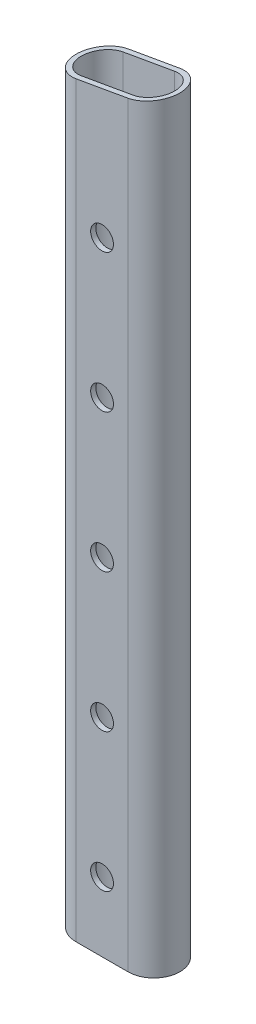
ISO-10303-21;
HEADER;
FILE_DESCRIPTION(('STEP AP214'),'2;1');
FILE_NAME('part.step','',(''),(''),'','','');
FILE_SCHEMA(('AUTOMOTIVE_DESIGN { 1 0 10303 214 1 1 1 1 }'));
ENDSEC;
DATA;
#1=APPLICATION_CONTEXT('core data for automotive mechanical design processes');
#2=APPLICATION_PROTOCOL_DEFINITION('international standard','automotive_design',2000,#1);
#3=PRODUCT_CONTEXT('',#1,'mechanical');
#4=PRODUCT('Part','Part','',(#3));
#5=PRODUCT_RELATED_PRODUCT_CATEGORY('part','',(#4));
#6=PRODUCT_DEFINITION_FORMATION('','',#4);
#7=PRODUCT_DEFINITION_CONTEXT('part definition',#1,'design');
#8=PRODUCT_DEFINITION('design','',#6,#7);
#9=PRODUCT_DEFINITION_SHAPE('','',#8);
#10=(LENGTH_UNIT() NAMED_UNIT(*) SI_UNIT(.MILLI.,.METRE.));
#11=(NAMED_UNIT(*) PLANE_ANGLE_UNIT() SI_UNIT($,.RADIAN.));
#12=(NAMED_UNIT(*) SI_UNIT($,.STERADIAN.) SOLID_ANGLE_UNIT());
#13=UNCERTAINTY_MEASURE_WITH_UNIT(LENGTH_MEASURE(1.E-05),#10,'distance_accuracy_value','');
#14=(GEOMETRIC_REPRESENTATION_CONTEXT(3) GLOBAL_UNCERTAINTY_ASSIGNED_CONTEXT((#13)) GLOBAL_UNIT_ASSIGNED_CONTEXT((#10,
#11,#12)) REPRESENTATION_CONTEXT('',''));
#15=CARTESIAN_POINT('',(0.,0.,0.));
#16=DIRECTION('',(0.,0.,1.));
#17=DIRECTION('',(1.,0.,0.));
#18=AXIS2_PLACEMENT_3D('',#15,#16,#17);
#19=CARTESIAN_POINT('',(-7.5,0.,0.));
#20=DIRECTION('',(0.,1.,0.));
#21=DIRECTION('',(0.,0.,1.));
#22=AXIS2_PLACEMENT_3D('',#19,#20,#21);
#23=PLANE('',#22);
#24=CARTESIAN_POINT('',(-7.5,0.,0.));
#25=DIRECTION('',(0.,1.,0.));
#26=DIRECTION('',(0.,0.,1.));
#27=AXIS2_PLACEMENT_3D('',#24,#25,#26);
#28=CIRCLE('',#27,7.5);
#29=CARTESIAN_POINT('',(-7.5,0.,-7.5));
#30=VERTEX_POINT('',#29);
#31=CARTESIAN_POINT('',(-7.5,0.,7.5));
#32=VERTEX_POINT('',#31);
#33=EDGE_CURVE('E120',#30,#32,#28,.T.);
#34=ORIENTED_EDGE('',*,*,#33,.F.);
#35=DIRECTION('',(-1.,0.,0.));
#36=VECTOR('',#35,1.);
#37=CARTESIAN_POINT('',(-7.5,0.,-7.5));
#38=LINE('',#37,#36);
#39=CARTESIAN_POINT('',(7.5,0.,-7.5));
#40=VERTEX_POINT('',#39);
#41=EDGE_CURVE('E211',#40,#30,#38,.T.);
#42=ORIENTED_EDGE('',*,*,#41,.F.);
#43=CARTESIAN_POINT('',(7.5,0.,0.));
#44=DIRECTION('',(0.,1.,0.));
#45=DIRECTION('',(0.,0.,1.));
#46=AXIS2_PLACEMENT_3D('',#43,#44,#45);
#47=CIRCLE('',#46,7.5);
#48=CARTESIAN_POINT('',(7.5,0.,7.5));
#49=VERTEX_POINT('',#48);
#50=EDGE_CURVE('E208',#49,#40,#47,.T.);
#51=ORIENTED_EDGE('',*,*,#50,.F.);
#52=DIRECTION('',(1.,0.,0.));
#53=VECTOR('',#52,1.);
#54=CARTESIAN_POINT('',(-7.5,0.,7.5));
#55=LINE('',#54,#53);
#56=EDGE_CURVE('E206',#32,#49,#55,.T.);
#57=ORIENTED_EDGE('',*,*,#56,.F.);
#58=EDGE_LOOP('',(#34,#42,#51,#57));
#59=FACE_BOUND('',#58,.T.);
#60=CARTESIAN_POINT('',(-7.5,0.,0.));
#61=DIRECTION('',(0.,1.,0.));
#62=DIRECTION('',(0.,0.,1.));
#63=AXIS2_PLACEMENT_3D('',#60,#61,#62);
#64=CIRCLE('',#63,6.);
#65=CARTESIAN_POINT('',(-7.5,0.,-6.));
#66=VERTEX_POINT('',#65);
#67=CARTESIAN_POINT('',(-7.5,0.,6.));
#68=VERTEX_POINT('',#67);
#69=EDGE_CURVE('E109',#66,#68,#64,.T.);
#70=ORIENTED_EDGE('',*,*,#69,.T.);
#71=DIRECTION('',(1.,0.,0.));
#72=VECTOR('',#71,1.);
#73=CARTESIAN_POINT('',(-7.5,0.,6.));
#74=LINE('',#73,#72);
#75=CARTESIAN_POINT('',(7.5,0.,6.));
#76=VERTEX_POINT('',#75);
#77=EDGE_CURVE('E188',#68,#76,#74,.T.);
#78=ORIENTED_EDGE('',*,*,#77,.T.);
#79=CARTESIAN_POINT('',(7.5,0.,0.));
#80=DIRECTION('',(0.,1.,0.));
#81=DIRECTION('',(0.,0.,1.));
#82=AXIS2_PLACEMENT_3D('',#79,#80,#81);
#83=CIRCLE('',#82,6.);
#84=CARTESIAN_POINT('',(7.5,0.,-6.));
#85=VERTEX_POINT('',#84);
#86=EDGE_CURVE('E191',#76,#85,#83,.T.);
#87=ORIENTED_EDGE('',*,*,#86,.T.);
#88=DIRECTION('',(-1.,0.,0.));
#89=VECTOR('',#88,1.);
#90=CARTESIAN_POINT('',(-7.5,0.,-6.));
#91=LINE('',#90,#89);
#92=EDGE_CURVE('E194',#85,#66,#91,.T.);
#93=ORIENTED_EDGE('',*,*,#92,.T.);
#94=EDGE_LOOP('',(#70,#78,#87,#93));
#95=FACE_BOUND('',#94,.T.);
#96=ADVANCED_FACE('F36',(#59,#95),#23,.F.);
#97=CARTESIAN_POINT('',(-7.5,220.,0.));
#98=DIRECTION('',(0.,-1.,0.));
#99=DIRECTION('',(0.,0.,-1.));
#100=AXIS2_PLACEMENT_3D('',#97,#98,#99);
#101=CYLINDRICAL_SURFACE('',#100,7.5);
#102=CARTESIAN_POINT('',(-7.5,216.03264293406,0.));
#103=DIRECTION('',(0.173648177666924,-0.984807753012209,0.));
#104=DIRECTION('',(-0.984807753012209,-0.173648177666923,0.));
#105=AXIS2_PLACEMENT_3D('',#102,#103,#104);
#106=ELLIPSE('',#105,7.61569958914308,7.5);
#107=CARTESIAN_POINT('',(-7.5,216.03264293406,7.5));
#108=VERTEX_POINT('',#107);
#109=CARTESIAN_POINT('',(-7.5,216.03264293406,-7.5));
#110=VERTEX_POINT('',#109);
#111=EDGE_CURVE('E100',#108,#110,#106,.T.);
#112=ORIENTED_EDGE('',*,*,#111,.T.);
#113=DIRECTION('',(0.,-1.,0.));
#114=VECTOR('',#113,1.);
#115=CARTESIAN_POINT('',(-7.5,220.,-7.5));
#116=LINE('',#115,#114);
#117=EDGE_CURVE('E214',#110,#30,#116,.T.);
#118=ORIENTED_EDGE('',*,*,#117,.T.);
#119=ORIENTED_EDGE('',*,*,#33,.T.);
#120=DIRECTION('',(0.,-1.,0.));
#121=VECTOR('',#120,1.);
#122=CARTESIAN_POINT('',(-7.5,220.,7.5));
#123=LINE('',#122,#121);
#124=EDGE_CURVE('E45',#108,#32,#123,.T.);
#125=ORIENTED_EDGE('',*,*,#124,.F.);
#126=EDGE_LOOP('',(#112,#118,#119,#125));
#127=FACE_BOUND('',#126,.T.);
#128=ADVANCED_FACE('F38',(#127),#101,.T.);
#129=CARTESIAN_POINT('',(-7.5,220.,7.5));
#130=DIRECTION('',(0.,0.,-1.));
#131=DIRECTION('',(-1.,0.,0.));
#132=AXIS2_PLACEMENT_3D('',#129,#130,#131);
#133=PLANE('',#132);
#134=CARTESIAN_POINT('',(0.,20.,7.5));
#135=DIRECTION('',(0.,0.,1.));
#136=DIRECTION('',(1.,0.,0.));
#137=AXIS2_PLACEMENT_3D('',#134,#135,#136);
#138=CIRCLE('',#137,3.3);
#139=CARTESIAN_POINT('',(3.30000000000001,20.,7.5));
#140=VERTEX_POINT('',#139);
#141=EDGE_CURVE('E277',#140,#140,#138,.T.);
#142=ORIENTED_EDGE('',*,*,#141,.F.);
#143=EDGE_LOOP('',(#142));
#144=FACE_BOUND('',#143,.T.);
#145=CARTESIAN_POINT('',(0.,60.,7.5));
#146=DIRECTION('',(0.,0.,1.));
#147=DIRECTION('',(1.,0.,0.));
#148=AXIS2_PLACEMENT_3D('',#145,#146,#147);
#149=CIRCLE('',#148,3.3);
#150=CARTESIAN_POINT('',(3.30000000000001,60.,7.5));
#151=VERTEX_POINT('',#150);
#152=EDGE_CURVE('E149',#151,#151,#149,.T.);
#153=ORIENTED_EDGE('',*,*,#152,.F.);
#154=EDGE_LOOP('',(#153));
#155=FACE_BOUND('',#154,.T.);
#156=CARTESIAN_POINT('',(0.,100.,7.5));
#157=DIRECTION('',(0.,0.,1.));
#158=DIRECTION('',(1.,0.,0.));
#159=AXIS2_PLACEMENT_3D('',#156,#157,#158);
#160=CIRCLE('',#159,3.3);
#161=CARTESIAN_POINT('',(3.30000000000001,100.,7.5));
#162=VERTEX_POINT('',#161);
#163=EDGE_CURVE('E146',#162,#162,#160,.T.);
#164=ORIENTED_EDGE('',*,*,#163,.F.);
#165=EDGE_LOOP('',(#164));
#166=FACE_BOUND('',#165,.T.);
#167=CARTESIAN_POINT('',(0.,140.,7.5));
#168=DIRECTION('',(0.,0.,1.));
#169=DIRECTION('',(1.,0.,0.));
#170=AXIS2_PLACEMENT_3D('',#167,#168,#169);
#171=CIRCLE('',#170,3.3);
#172=CARTESIAN_POINT('',(3.30000000000001,140.,7.5));
#173=VERTEX_POINT('',#172);
#174=EDGE_CURVE('E165',#173,#173,#171,.T.);
#175=ORIENTED_EDGE('',*,*,#174,.F.);
#176=EDGE_LOOP('',(#175));
#177=FACE_BOUND('',#176,.T.);
#178=CARTESIAN_POINT('',(0.,180.,7.5));
#179=DIRECTION('',(0.,0.,1.));
#180=DIRECTION('',(1.,0.,0.));
#181=AXIS2_PLACEMENT_3D('',#178,#179,#180);
#182=CIRCLE('',#181,3.3);
#183=CARTESIAN_POINT('',(3.3,180.,7.5));
#184=VERTEX_POINT('',#183);
#185=EDGE_CURVE('E172',#184,#184,#182,.T.);
#186=ORIENTED_EDGE('',*,*,#185,.F.);
#187=EDGE_LOOP('',(#186));
#188=FACE_BOUND('',#187,.T.);
#189=DIRECTION('',(0.,-1.,0.));
#190=VECTOR('',#189,1.);
#191=CARTESIAN_POINT('',(7.5,220.,7.5));
#192=LINE('',#191,#190);
#193=CARTESIAN_POINT('',(7.5,218.677547644687,7.5));
#194=VERTEX_POINT('',#193);
#195=EDGE_CURVE('E115',#194,#49,#192,.T.);
#196=ORIENTED_EDGE('',*,*,#195,.F.);
#197=DIRECTION('',(0.984807753012209,0.173648177666923,0.));
#198=VECTOR('',#197,1.);
#199=CARTESIAN_POINT('',(-15.,214.710190578746,7.5));
#200=LINE('',#199,#198);
#201=EDGE_CURVE('E103',#108,#194,#200,.T.);
#202=ORIENTED_EDGE('',*,*,#201,.F.);
#203=ORIENTED_EDGE('',*,*,#124,.T.);
#204=ORIENTED_EDGE('',*,*,#56,.T.);
#205=EDGE_LOOP('',(#196,#202,#203,#204));
#206=FACE_BOUND('',#205,.T.);
#207=ADVANCED_FACE('F112',(#144,#155,#166,#177,#188,#206),#133,.F.);
#208=CARTESIAN_POINT('',(7.5,220.,0.));
#209=DIRECTION('',(0.,-1.,0.));
#210=DIRECTION('',(0.,0.,-1.));
#211=AXIS2_PLACEMENT_3D('',#208,#209,#210);
#212=CYLINDRICAL_SURFACE('',#211,7.5);
#213=DIRECTION('',(0.,-1.,0.));
#214=VECTOR('',#213,1.);
#215=CARTESIAN_POINT('',(7.5,220.,-7.5));
#216=LINE('',#215,#214);
#217=CARTESIAN_POINT('',(7.5,218.677547644687,-7.5));
#218=VERTEX_POINT('',#217);
#219=EDGE_CURVE('E122',#218,#40,#216,.T.);
#220=ORIENTED_EDGE('',*,*,#219,.F.);
#221=CARTESIAN_POINT('',(7.5,218.677547644687,0.));
#222=DIRECTION('',(0.173648177666924,-0.984807753012209,0.));
#223=DIRECTION('',(-0.984807753012209,-0.173648177666923,0.));
#224=AXIS2_PLACEMENT_3D('',#221,#222,#223);
#225=ELLIPSE('',#224,7.61569958914308,7.5);
#226=EDGE_CURVE('E53',#218,#194,#225,.T.);
#227=ORIENTED_EDGE('',*,*,#226,.T.);
#228=ORIENTED_EDGE('',*,*,#195,.T.);
#229=ORIENTED_EDGE('',*,*,#50,.T.);
#230=EDGE_LOOP('',(#220,#227,#228,#229));
#231=FACE_BOUND('',#230,.T.);
#232=ADVANCED_FACE('F221',(#231),#212,.T.);
#233=CARTESIAN_POINT('',(-7.5,220.,-7.5));
#234=DIRECTION('',(0.,0.,1.));
#235=DIRECTION('',(1.,0.,0.));
#236=AXIS2_PLACEMENT_3D('',#233,#234,#235);
#237=PLANE('',#236);
#238=CARTESIAN_POINT('',(0.,20.,-7.5));
#239=DIRECTION('',(0.,0.,1.));
#240=DIRECTION('',(1.,0.,0.));
#241=AXIS2_PLACEMENT_3D('',#238,#239,#240);
#242=CIRCLE('',#241,3.3);
#243=CARTESIAN_POINT('',(3.30000000000001,20.,-7.5));
#244=VERTEX_POINT('',#243);
#245=EDGE_CURVE('E326',#244,#244,#242,.T.);
#246=ORIENTED_EDGE('',*,*,#245,.T.);
#247=EDGE_LOOP('',(#246));
#248=FACE_BOUND('',#247,.T.);
#249=CARTESIAN_POINT('',(0.,60.,-7.5));
#250=DIRECTION('',(0.,0.,1.));
#251=DIRECTION('',(1.,0.,0.));
#252=AXIS2_PLACEMENT_3D('',#249,#250,#251);
#253=CIRCLE('',#252,3.3);
#254=CARTESIAN_POINT('',(3.30000000000001,60.,-7.5));
#255=VERTEX_POINT('',#254);
#256=EDGE_CURVE('E142',#255,#255,#253,.T.);
#257=ORIENTED_EDGE('',*,*,#256,.T.);
#258=EDGE_LOOP('',(#257));
#259=FACE_BOUND('',#258,.T.);
#260=CARTESIAN_POINT('',(0.,100.,-7.5));
#261=DIRECTION('',(0.,0.,1.));
#262=DIRECTION('',(1.,0.,0.));
#263=AXIS2_PLACEMENT_3D('',#260,#261,#262);
#264=CIRCLE('',#263,3.3);
#265=CARTESIAN_POINT('',(3.30000000000001,100.,-7.5));
#266=VERTEX_POINT('',#265);
#267=EDGE_CURVE('E138',#266,#266,#264,.T.);
#268=ORIENTED_EDGE('',*,*,#267,.T.);
#269=EDGE_LOOP('',(#268));
#270=FACE_BOUND('',#269,.T.);
#271=CARTESIAN_POINT('',(0.,140.,-7.5));
#272=DIRECTION('',(0.,0.,1.));
#273=DIRECTION('',(1.,0.,0.));
#274=AXIS2_PLACEMENT_3D('',#271,#272,#273);
#275=CIRCLE('',#274,3.3);
#276=CARTESIAN_POINT('',(3.30000000000001,140.,-7.5));
#277=VERTEX_POINT('',#276);
#278=EDGE_CURVE('E134',#277,#277,#275,.T.);
#279=ORIENTED_EDGE('',*,*,#278,.T.);
#280=EDGE_LOOP('',(#279));
#281=FACE_BOUND('',#280,.T.);
#282=CARTESIAN_POINT('',(0.,180.,-7.5));
#283=DIRECTION('',(0.,0.,1.));
#284=DIRECTION('',(1.,0.,0.));
#285=AXIS2_PLACEMENT_3D('',#282,#283,#284);
#286=CIRCLE('',#285,3.3);
#287=CARTESIAN_POINT('',(3.3,180.,-7.5));
#288=VERTEX_POINT('',#287);
#289=EDGE_CURVE('E129',#288,#288,#286,.T.);
#290=ORIENTED_EDGE('',*,*,#289,.T.);
#291=EDGE_LOOP('',(#290));
#292=FACE_BOUND('',#291,.T.);
#293=ORIENTED_EDGE('',*,*,#117,.F.);
#294=DIRECTION('',(0.984807753012209,0.173648177666923,0.));
#295=VECTOR('',#294,1.);
#296=CARTESIAN_POINT('',(-15.,214.710190578746,-7.5));
#297=LINE('',#296,#295);
#298=EDGE_CURVE('E105',#110,#218,#297,.T.);
#299=ORIENTED_EDGE('',*,*,#298,.T.);
#300=ORIENTED_EDGE('',*,*,#219,.T.);
#301=ORIENTED_EDGE('',*,*,#41,.T.);
#302=EDGE_LOOP('',(#293,#299,#300,#301));
#303=FACE_BOUND('',#302,.T.);
#304=ADVANCED_FACE('F217',(#248,#259,#270,#281,#292,#303),#237,.F.);
#305=CARTESIAN_POINT('',(-7.5,220.,0.));
#306=DIRECTION('',(0.,-1.,0.));
#307=DIRECTION('',(0.,0.,-1.));
#308=AXIS2_PLACEMENT_3D('',#305,#306,#307);
#309=CYLINDRICAL_SURFACE('',#308,6.);
#310=CARTESIAN_POINT('',(-7.5,216.03264293406,0.));
#311=DIRECTION('',(0.173648177666924,-0.984807753012209,0.));
#312=DIRECTION('',(-0.984807753012209,-0.173648177666923,0.));
#313=AXIS2_PLACEMENT_3D('',#310,#311,#312);
#314=ELLIPSE('',#313,6.09255967131446,6.);
#315=CARTESIAN_POINT('',(-7.5,216.03264293406,6.));
#316=VERTEX_POINT('',#315);
#317=CARTESIAN_POINT('',(-7.5,216.03264293406,-6.));
#318=VERTEX_POINT('',#317);
#319=EDGE_CURVE('E60',#316,#318,#314,.T.);
#320=ORIENTED_EDGE('',*,*,#319,.F.);
#321=DIRECTION('',(0.,-1.,0.));
#322=VECTOR('',#321,1.);
#323=CARTESIAN_POINT('',(-7.5,220.,6.));
#324=LINE('',#323,#322);
#325=EDGE_CURVE('E203',#316,#68,#324,.T.);
#326=ORIENTED_EDGE('',*,*,#325,.T.);
#327=ORIENTED_EDGE('',*,*,#69,.F.);
#328=DIRECTION('',(0.,-1.,0.));
#329=VECTOR('',#328,1.);
#330=CARTESIAN_POINT('',(-7.5,220.,-6.));
#331=LINE('',#330,#329);
#332=EDGE_CURVE('E197',#318,#66,#331,.T.);
#333=ORIENTED_EDGE('',*,*,#332,.F.);
#334=EDGE_LOOP('',(#320,#326,#327,#333));
#335=FACE_BOUND('',#334,.T.);
#336=ADVANCED_FACE('F231',(#335),#309,.F.);
#337=CARTESIAN_POINT('',(-7.5,220.,6.));
#338=DIRECTION('',(0.,0.,-1.));
#339=DIRECTION('',(-1.,0.,0.));
#340=AXIS2_PLACEMENT_3D('',#337,#338,#339);
#341=PLANE('',#340);
#342=CARTESIAN_POINT('',(0.,20.,6.));
#343=DIRECTION('',(0.,0.,-1.));
#344=DIRECTION('',(-1.,0.,0.));
#345=AXIS2_PLACEMENT_3D('',#342,#343,#344);
#346=CIRCLE('',#345,3.3);
#347=CARTESIAN_POINT('',(-3.29999999999999,20.,6.));
#348=VERTEX_POINT('',#347);
#349=EDGE_CURVE('E154',#348,#348,#346,.T.);
#350=ORIENTED_EDGE('',*,*,#349,.F.);
#351=EDGE_LOOP('',(#350));
#352=FACE_BOUND('',#351,.T.);
#353=CARTESIAN_POINT('',(0.,60.,6.));
#354=DIRECTION('',(0.,0.,-1.));
#355=DIRECTION('',(-1.,0.,0.));
#356=AXIS2_PLACEMENT_3D('',#353,#354,#355);
#357=CIRCLE('',#356,3.3);
#358=CARTESIAN_POINT('',(-3.29999999999999,60.,6.));
#359=VERTEX_POINT('',#358);
#360=EDGE_CURVE('E141',#359,#359,#357,.T.);
#361=ORIENTED_EDGE('',*,*,#360,.F.);
#362=EDGE_LOOP('',(#361));
#363=FACE_BOUND('',#362,.T.);
#364=CARTESIAN_POINT('',(0.,100.,6.));
#365=DIRECTION('',(0.,0.,-1.));
#366=DIRECTION('',(-1.,0.,0.));
#367=AXIS2_PLACEMENT_3D('',#364,#365,#366);
#368=CIRCLE('',#367,3.3);
#369=CARTESIAN_POINT('',(-3.29999999999999,100.,6.));
#370=VERTEX_POINT('',#369);
#371=EDGE_CURVE('E137',#370,#370,#368,.T.);
#372=ORIENTED_EDGE('',*,*,#371,.F.);
#373=EDGE_LOOP('',(#372));
#374=FACE_BOUND('',#373,.T.);
#375=CARTESIAN_POINT('',(0.,140.,6.));
#376=DIRECTION('',(0.,0.,-1.));
#377=DIRECTION('',(-1.,0.,0.));
#378=AXIS2_PLACEMENT_3D('',#375,#376,#377);
#379=CIRCLE('',#378,3.3);
#380=CARTESIAN_POINT('',(-3.29999999999999,140.,6.));
#381=VERTEX_POINT('',#380);
#382=EDGE_CURVE('E133',#381,#381,#379,.T.);
#383=ORIENTED_EDGE('',*,*,#382,.F.);
#384=EDGE_LOOP('',(#383));
#385=FACE_BOUND('',#384,.T.);
#386=CARTESIAN_POINT('',(0.,180.,6.));
#387=DIRECTION('',(0.,0.,-1.));
#388=DIRECTION('',(-1.,0.,0.));
#389=AXIS2_PLACEMENT_3D('',#386,#387,#388);
#390=CIRCLE('',#389,3.3);
#391=CARTESIAN_POINT('',(-3.29999999999999,180.,6.));
#392=VERTEX_POINT('',#391);
#393=EDGE_CURVE('E116',#392,#392,#390,.T.);
#394=ORIENTED_EDGE('',*,*,#393,.F.);
#395=EDGE_LOOP('',(#394));
#396=FACE_BOUND('',#395,.T.);
#397=DIRECTION('',(-0.984807753012209,-0.173648177666924,0.));
#398=VECTOR('',#397,1.);
#399=CARTESIAN_POINT('',(-6.82154198384152,216.152273387586,6.));
#400=LINE('',#399,#398);
#401=CARTESIAN_POINT('',(7.5,218.677547644687,6.));
#402=VERTEX_POINT('',#401);
#403=EDGE_CURVE('E182',#402,#316,#400,.T.);
#404=ORIENTED_EDGE('',*,*,#403,.F.);
#405=DIRECTION('',(0.,-1.,0.));
#406=VECTOR('',#405,1.);
#407=CARTESIAN_POINT('',(7.5,220.,6.));
#408=LINE('',#407,#406);
#409=EDGE_CURVE('E201',#402,#76,#408,.T.);
#410=ORIENTED_EDGE('',*,*,#409,.T.);
#411=ORIENTED_EDGE('',*,*,#77,.F.);
#412=ORIENTED_EDGE('',*,*,#325,.F.);
#413=EDGE_LOOP('',(#404,#410,#411,#412));
#414=FACE_BOUND('',#413,.T.);
#415=ADVANCED_FACE('F235',(#352,#363,#374,#385,#396,#414),#341,.T.);
#416=CARTESIAN_POINT('',(7.5,220.,0.));
#417=DIRECTION('',(0.,-1.,0.));
#418=DIRECTION('',(0.,0.,-1.));
#419=AXIS2_PLACEMENT_3D('',#416,#417,#418);
#420=CYLINDRICAL_SURFACE('',#419,6.);
#421=CARTESIAN_POINT('',(7.5,218.677547644687,0.));
#422=DIRECTION('',(0.173648177666924,-0.984807753012209,0.));
#423=DIRECTION('',(-0.984807753012209,-0.173648177666923,0.));
#424=AXIS2_PLACEMENT_3D('',#421,#422,#423);
#425=ELLIPSE('',#424,6.09255967131446,6.);
#426=CARTESIAN_POINT('',(7.5,218.677547644687,-6.));
#427=VERTEX_POINT('',#426);
#428=EDGE_CURVE('E179',#427,#402,#425,.T.);
#429=ORIENTED_EDGE('',*,*,#428,.F.);
#430=DIRECTION('',(0.,-1.,0.));
#431=VECTOR('',#430,1.);
#432=CARTESIAN_POINT('',(7.5,220.,-6.));
#433=LINE('',#432,#431);
#434=EDGE_CURVE('E199',#427,#85,#433,.T.);
#435=ORIENTED_EDGE('',*,*,#434,.T.);
#436=ORIENTED_EDGE('',*,*,#86,.F.);
#437=ORIENTED_EDGE('',*,*,#409,.F.);
#438=EDGE_LOOP('',(#429,#435,#436,#437));
#439=FACE_BOUND('',#438,.T.);
#440=ADVANCED_FACE('F240',(#439),#420,.F.);
#441=CARTESIAN_POINT('',(-7.5,220.,-6.));
#442=DIRECTION('',(0.,0.,1.));
#443=DIRECTION('',(1.,0.,0.));
#444=AXIS2_PLACEMENT_3D('',#441,#442,#443);
#445=PLANE('',#444);
#446=CARTESIAN_POINT('',(0.,20.,-6.));
#447=DIRECTION('',(0.,0.,1.));
#448=DIRECTION('',(1.,0.,0.));
#449=AXIS2_PLACEMENT_3D('',#446,#447,#448);
#450=CIRCLE('',#449,3.3);
#451=CARTESIAN_POINT('',(3.30000000000001,20.,-6.));
#452=VERTEX_POINT('',#451);
#453=EDGE_CURVE('E40',#452,#452,#450,.T.);
#454=ORIENTED_EDGE('',*,*,#453,.F.);
#455=EDGE_LOOP('',(#454));
#456=FACE_BOUND('',#455,.T.);
#457=CARTESIAN_POINT('',(0.,60.,-6.));
#458=DIRECTION('',(0.,0.,1.));
#459=DIRECTION('',(1.,0.,0.));
#460=AXIS2_PLACEMENT_3D('',#457,#458,#459);
#461=CIRCLE('',#460,3.3);
#462=CARTESIAN_POINT('',(3.30000000000001,60.,-6.));
#463=VERTEX_POINT('',#462);
#464=EDGE_CURVE('E139',#463,#463,#461,.T.);
#465=ORIENTED_EDGE('',*,*,#464,.F.);
#466=EDGE_LOOP('',(#465));
#467=FACE_BOUND('',#466,.T.);
#468=CARTESIAN_POINT('',(0.,100.,-6.));
#469=DIRECTION('',(0.,0.,1.));
#470=DIRECTION('',(1.,0.,0.));
#471=AXIS2_PLACEMENT_3D('',#468,#469,#470);
#472=CIRCLE('',#471,3.3);
#473=CARTESIAN_POINT('',(3.30000000000001,100.,-6.));
#474=VERTEX_POINT('',#473);
#475=EDGE_CURVE('E135',#474,#474,#472,.T.);
#476=ORIENTED_EDGE('',*,*,#475,.F.);
#477=EDGE_LOOP('',(#476));
#478=FACE_BOUND('',#477,.T.);
#479=CARTESIAN_POINT('',(0.,140.,-6.));
#480=DIRECTION('',(0.,0.,1.));
#481=DIRECTION('',(1.,0.,0.));
#482=AXIS2_PLACEMENT_3D('',#479,#480,#481);
#483=CIRCLE('',#482,3.3);
#484=CARTESIAN_POINT('',(3.30000000000001,140.,-6.));
#485=VERTEX_POINT('',#484);
#486=EDGE_CURVE('E130',#485,#485,#483,.T.);
#487=ORIENTED_EDGE('',*,*,#486,.F.);
#488=EDGE_LOOP('',(#487));
#489=FACE_BOUND('',#488,.T.);
#490=CARTESIAN_POINT('',(0.,180.,-6.));
#491=DIRECTION('',(0.,0.,1.));
#492=DIRECTION('',(1.,0.,0.));
#493=AXIS2_PLACEMENT_3D('',#490,#491,#492);
#494=CIRCLE('',#493,3.3);
#495=CARTESIAN_POINT('',(3.3,180.,-6.));
#496=VERTEX_POINT('',#495);
#497=EDGE_CURVE('E126',#496,#496,#494,.T.);
#498=ORIENTED_EDGE('',*,*,#497,.F.);
#499=EDGE_LOOP('',(#498));
#500=FACE_BOUND('',#499,.T.);
#501=DIRECTION('',(0.984807753012209,0.173648177666924,0.));
#502=VECTOR('',#501,1.);
#503=CARTESIAN_POINT('',(-6.82154198384152,216.152273387586,-6.));
#504=LINE('',#503,#502);
#505=EDGE_CURVE('E11',#318,#427,#504,.T.);
#506=ORIENTED_EDGE('',*,*,#505,.F.);
#507=ORIENTED_EDGE('',*,*,#332,.T.);
#508=ORIENTED_EDGE('',*,*,#92,.F.);
#509=ORIENTED_EDGE('',*,*,#434,.F.);
#510=EDGE_LOOP('',(#506,#507,#508,#509));
#511=FACE_BOUND('',#510,.T.);
#512=ADVANCED_FACE('F243',(#456,#467,#478,#489,#500,#511),#445,.T.);
#513=CARTESIAN_POINT('',(-15.,214.710190578746,-7.5));
#514=DIRECTION('',(0.173648177666924,-0.984807753012209,0.));
#515=DIRECTION('',(0.984807753012209,0.173648177666924,0.));
#516=AXIS2_PLACEMENT_3D('',#513,#514,#515);
#517=PLANE('',#516);
#518=ORIENTED_EDGE('',*,*,#319,.T.);
#519=ORIENTED_EDGE('',*,*,#505,.T.);
#520=ORIENTED_EDGE('',*,*,#428,.T.);
#521=ORIENTED_EDGE('',*,*,#403,.T.);
#522=EDGE_LOOP('',(#518,#519,#520,#521));
#523=FACE_BOUND('',#522,.T.);
#524=ORIENTED_EDGE('',*,*,#111,.F.);
#525=ORIENTED_EDGE('',*,*,#201,.T.);
#526=ORIENTED_EDGE('',*,*,#226,.F.);
#527=ORIENTED_EDGE('',*,*,#298,.F.);
#528=EDGE_LOOP('',(#524,#525,#526,#527));
#529=FACE_BOUND('',#528,.T.);
#530=ADVANCED_FACE('F102',(#523,#529),#517,.F.);
#531=CARTESIAN_POINT('',(0.,180.,-7.5));
#532=DIRECTION('',(0.,0.,1.));
#533=DIRECTION('',(1.,0.,0.));
#534=AXIS2_PLACEMENT_3D('',#531,#532,#533);
#535=CYLINDRICAL_SURFACE('',#534,3.3);
#536=ORIENTED_EDGE('',*,*,#497,.T.);
#537=EDGE_LOOP('',(#536));
#538=FACE_BOUND('',#537,.T.);
#539=ORIENTED_EDGE('',*,*,#289,.F.);
#540=EDGE_LOOP('',(#539));
#541=FACE_BOUND('',#540,.T.);
#542=ADVANCED_FACE('F245',(#538,#541),#535,.F.);
#543=ORIENTED_EDGE('',*,*,#393,.T.);
#544=EDGE_LOOP('',(#543));
#545=FACE_BOUND('',#544,.T.);
#546=ORIENTED_EDGE('',*,*,#185,.T.);
#547=EDGE_LOOP('',(#546));
#548=FACE_BOUND('',#547,.T.);
#549=ADVANCED_FACE('F251',(#545,#548),#535,.F.);
#550=CARTESIAN_POINT('',(0.,140.,-7.5));
#551=DIRECTION('',(0.,0.,1.));
#552=DIRECTION('',(1.,0.,0.));
#553=AXIS2_PLACEMENT_3D('',#550,#551,#552);
#554=CYLINDRICAL_SURFACE('',#553,3.3);
#555=ORIENTED_EDGE('',*,*,#486,.T.);
#556=EDGE_LOOP('',(#555));
#557=FACE_BOUND('',#556,.T.);
#558=ORIENTED_EDGE('',*,*,#278,.F.);
#559=EDGE_LOOP('',(#558));
#560=FACE_BOUND('',#559,.T.);
#561=ADVANCED_FACE('F287',(#557,#560),#554,.F.);
#562=ORIENTED_EDGE('',*,*,#382,.T.);
#563=EDGE_LOOP('',(#562));
#564=FACE_BOUND('',#563,.T.);
#565=ORIENTED_EDGE('',*,*,#174,.T.);
#566=EDGE_LOOP('',(#565));
#567=FACE_BOUND('',#566,.T.);
#568=ADVANCED_FACE('F292',(#564,#567),#554,.F.);
#569=CARTESIAN_POINT('',(0.,100.,-7.5));
#570=DIRECTION('',(0.,0.,1.));
#571=DIRECTION('',(1.,0.,0.));
#572=AXIS2_PLACEMENT_3D('',#569,#570,#571);
#573=CYLINDRICAL_SURFACE('',#572,3.3);
#574=ORIENTED_EDGE('',*,*,#475,.T.);
#575=EDGE_LOOP('',(#574));
#576=FACE_BOUND('',#575,.T.);
#577=ORIENTED_EDGE('',*,*,#267,.F.);
#578=EDGE_LOOP('',(#577));
#579=FACE_BOUND('',#578,.T.);
#580=ADVANCED_FACE('F299',(#576,#579),#573,.F.);
#581=ORIENTED_EDGE('',*,*,#371,.T.);
#582=EDGE_LOOP('',(#581));
#583=FACE_BOUND('',#582,.T.);
#584=ORIENTED_EDGE('',*,*,#163,.T.);
#585=EDGE_LOOP('',(#584));
#586=FACE_BOUND('',#585,.T.);
#587=ADVANCED_FACE('F305',(#583,#586),#573,.F.);
#588=CARTESIAN_POINT('',(0.,60.,-7.5));
#589=DIRECTION('',(0.,0.,1.));
#590=DIRECTION('',(1.,0.,0.));
#591=AXIS2_PLACEMENT_3D('',#588,#589,#590);
#592=CYLINDRICAL_SURFACE('',#591,3.3);
#593=ORIENTED_EDGE('',*,*,#464,.T.);
#594=EDGE_LOOP('',(#593));
#595=FACE_BOUND('',#594,.T.);
#596=ORIENTED_EDGE('',*,*,#256,.F.);
#597=EDGE_LOOP('',(#596));
#598=FACE_BOUND('',#597,.T.);
#599=ADVANCED_FACE('F307',(#595,#598),#592,.F.);
#600=ORIENTED_EDGE('',*,*,#360,.T.);
#601=EDGE_LOOP('',(#600));
#602=FACE_BOUND('',#601,.T.);
#603=ORIENTED_EDGE('',*,*,#152,.T.);
#604=EDGE_LOOP('',(#603));
#605=FACE_BOUND('',#604,.T.);
#606=ADVANCED_FACE('F310',(#602,#605),#592,.F.);
#607=CARTESIAN_POINT('',(0.,20.,-7.5));
#608=DIRECTION('',(0.,0.,1.));
#609=DIRECTION('',(1.,0.,0.));
#610=AXIS2_PLACEMENT_3D('',#607,#608,#609);
#611=CYLINDRICAL_SURFACE('',#610,3.3);
#612=ORIENTED_EDGE('',*,*,#453,.T.);
#613=EDGE_LOOP('',(#612));
#614=FACE_BOUND('',#613,.T.);
#615=ORIENTED_EDGE('',*,*,#245,.F.);
#616=EDGE_LOOP('',(#615));
#617=FACE_BOUND('',#616,.T.);
#618=ADVANCED_FACE('F311',(#614,#617),#611,.F.);
#619=ORIENTED_EDGE('',*,*,#349,.T.);
#620=EDGE_LOOP('',(#619));
#621=FACE_BOUND('',#620,.T.);
#622=ORIENTED_EDGE('',*,*,#141,.T.);
#623=EDGE_LOOP('',(#622));
#624=FACE_BOUND('',#623,.T.);
#625=ADVANCED_FACE('F313',(#621,#624),#611,.F.);
#626=CLOSED_SHELL('',(#96,#128,#207,#232,#304,#336,#415,#440,#512,#530,#542,#549,#561,#568,#580,
#587,#599,#606,#618,#625));
#627=MANIFOLD_SOLID_BREP('B2',#626);
#628=ADVANCED_BREP_SHAPE_REPRESENTATION('',(#18,#627),#14);
#629=SHAPE_DEFINITION_REPRESENTATION(#9,#628);
ENDSEC;
END-ISO-10303-21;
